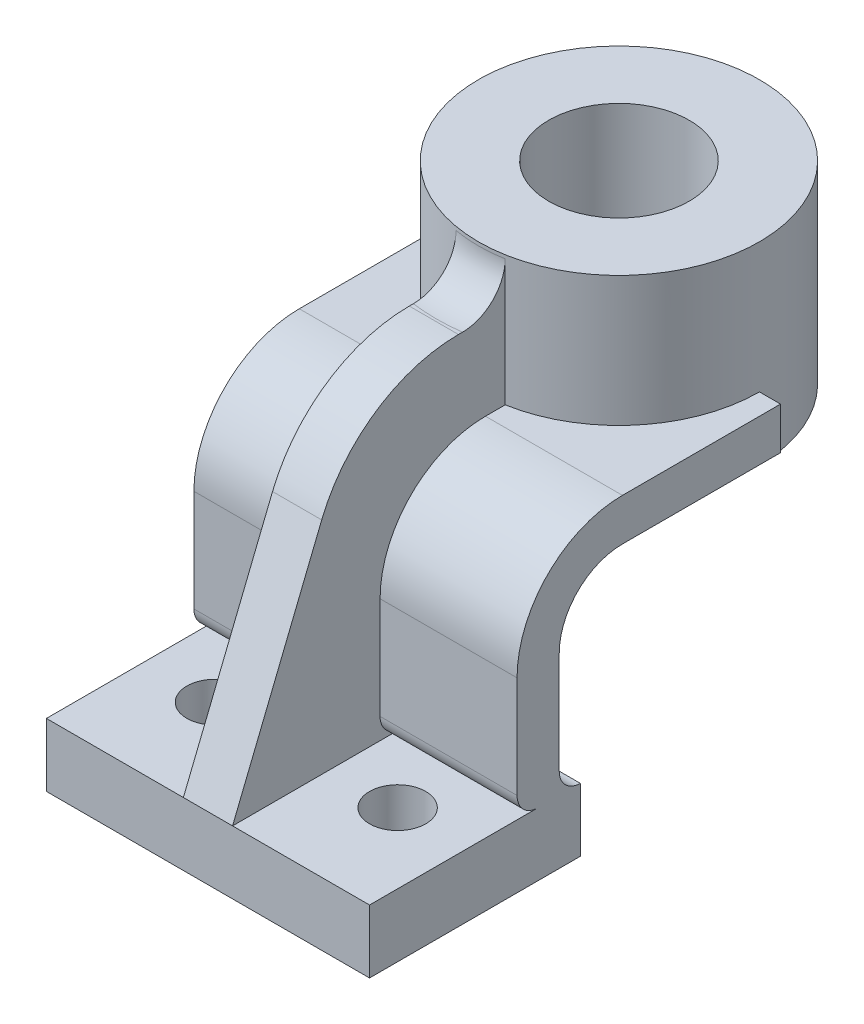
ISO-10303-21;
HEADER;
FILE_DESCRIPTION(('STEP AP214'),'2;1');
FILE_NAME('part.step','',(''),(''),'','','');
FILE_SCHEMA(('AUTOMOTIVE_DESIGN { 1 0 10303 214 1 1 1 1 }'));
ENDSEC;
DATA;
#1=APPLICATION_CONTEXT('core data for automotive mechanical design processes');
#2=APPLICATION_PROTOCOL_DEFINITION('international standard','automotive_design',2000,#1);
#3=PRODUCT_CONTEXT('',#1,'mechanical');
#4=PRODUCT('Part','Part','',(#3));
#5=PRODUCT_RELATED_PRODUCT_CATEGORY('part','',(#4));
#6=PRODUCT_DEFINITION_FORMATION('','',#4);
#7=PRODUCT_DEFINITION_CONTEXT('part definition',#1,'design');
#8=PRODUCT_DEFINITION('design','',#6,#7);
#9=PRODUCT_DEFINITION_SHAPE('','',#8);
#10=(LENGTH_UNIT() NAMED_UNIT(*) SI_UNIT(.MILLI.,.METRE.));
#11=(NAMED_UNIT(*) PLANE_ANGLE_UNIT() SI_UNIT($,.RADIAN.));
#12=(NAMED_UNIT(*) SI_UNIT($,.STERADIAN.) SOLID_ANGLE_UNIT());
#13=UNCERTAINTY_MEASURE_WITH_UNIT(LENGTH_MEASURE(1.E-05),#10,'distance_accuracy_value','');
#14=(GEOMETRIC_REPRESENTATION_CONTEXT(3) GLOBAL_UNCERTAINTY_ASSIGNED_CONTEXT((#13)) GLOBAL_UNIT_ASSIGNED_CONTEXT((#10,
#11,#12)) REPRESENTATION_CONTEXT('',''));
#15=CARTESIAN_POINT('',(0.,0.,0.));
#16=DIRECTION('',(0.,0.,1.));
#17=DIRECTION('',(1.,0.,0.));
#18=AXIS2_PLACEMENT_3D('',#15,#16,#17);
#19=CARTESIAN_POINT('',(0.,18.,0.));
#20=DIRECTION('',(0.,-1.,0.));
#21=DIRECTION('',(0.,0.,-1.));
#22=AXIS2_PLACEMENT_3D('',#19,#20,#21);
#23=PLANE('',#22);
#24=CARTESIAN_POINT('',(-26.,18.,1.99999999999999));
#25=DIRECTION('',(0.,1.,0.));
#26=DIRECTION('',(0.,0.,-1.));
#27=AXIS2_PLACEMENT_3D('',#24,#25,#26);
#28=CIRCLE('',#27,8.);
#29=CARTESIAN_POINT('',(-26.,18.,-6.00000000000001));
#30=VERTEX_POINT('',#29);
#31=EDGE_CURVE('E273',#30,#30,#28,.T.);
#32=ORIENTED_EDGE('',*,*,#31,.F.);
#33=EDGE_LOOP('',(#32));
#34=FACE_BOUND('',#33,.T.);
#35=DIRECTION('',(0.,0.,1.));
#36=VECTOR('',#35,1.);
#37=CARTESIAN_POINT('',(-7.,18.,0.));
#38=LINE('',#37,#36);
#39=CARTESIAN_POINT('',(-7.,18.,-18.));
#40=VERTEX_POINT('',#39);
#41=CARTESIAN_POINT('',(-7.,18.,30.));
#42=VERTEX_POINT('',#41);
#43=EDGE_CURVE('E230',#40,#42,#38,.T.);
#44=ORIENTED_EDGE('',*,*,#43,.F.);
#45=DIRECTION('',(1.,0.,0.));
#46=VECTOR('',#45,1.);
#47=CARTESIAN_POINT('',(-46.,18.,-18.));
#48=LINE('',#47,#46);
#49=CARTESIAN_POINT('',(-46.,18.,-18.));
#50=VERTEX_POINT('',#49);
#51=EDGE_CURVE('E297',#50,#40,#48,.T.);
#52=ORIENTED_EDGE('',*,*,#51,.F.);
#53=DIRECTION('',(0.,0.,1.));
#54=VECTOR('',#53,1.);
#55=CARTESIAN_POINT('',(-46.,18.,30.));
#56=LINE('',#55,#54);
#57=CARTESIAN_POINT('',(-46.,18.,30.));
#58=VERTEX_POINT('',#57);
#59=EDGE_CURVE('E251',#50,#58,#56,.T.);
#60=ORIENTED_EDGE('',*,*,#59,.T.);
#61=DIRECTION('',(1.,0.,0.));
#62=VECTOR('',#61,1.);
#63=CARTESIAN_POINT('',(-46.,18.,30.));
#64=LINE('',#63,#62);
#65=EDGE_CURVE('E245',#58,#42,#64,.T.);
#66=ORIENTED_EDGE('',*,*,#65,.T.);
#67=EDGE_LOOP('',(#44,#52,#60,#66));
#68=FACE_BOUND('',#67,.T.);
#69=ADVANCED_FACE('F41',(#34,#68),#23,.F.);
#70=CARTESIAN_POINT('',(-46.,0.,-12.));
#71=DIRECTION('',(0.,0.,-1.));
#72=DIRECTION('',(-1.,0.,0.));
#73=AXIS2_PLACEMENT_3D('',#70,#71,#72);
#74=PLANE('',#73);
#75=DIRECTION('',(0.,-1.,0.));
#76=VECTOR('',#75,1.);
#77=CARTESIAN_POINT('',(-7.,0.,-12.));
#78=LINE('',#77,#76);
#79=CARTESIAN_POINT('',(-7.,52.9999999999999,-12.));
#80=VERTEX_POINT('',#79);
#81=CARTESIAN_POINT('',(-7.,24.,-12.));
#82=VERTEX_POINT('',#81);
#83=EDGE_CURVE('E439',#80,#82,#78,.T.);
#84=ORIENTED_EDGE('',*,*,#83,.F.);
#85=DIRECTION('',(1.,0.,0.));
#86=VECTOR('',#85,1.);
#87=CARTESIAN_POINT('',(-46.,52.9999999999999,-12.));
#88=LINE('',#87,#86);
#89=CARTESIAN_POINT('',(-46.,52.9999999999999,-12.));
#90=VERTEX_POINT('',#89);
#91=EDGE_CURVE('E278',#90,#80,#88,.T.);
#92=ORIENTED_EDGE('',*,*,#91,.F.);
#93=DIRECTION('',(0.,1.,0.));
#94=VECTOR('',#93,1.);
#95=CARTESIAN_POINT('',(-46.,0.,-12.));
#96=LINE('',#95,#94);
#97=CARTESIAN_POINT('',(-46.,24.,-12.));
#98=VERTEX_POINT('',#97);
#99=EDGE_CURVE('E329',#98,#90,#96,.T.);
#100=ORIENTED_EDGE('',*,*,#99,.F.);
#101=DIRECTION('',(1.,0.,0.));
#102=VECTOR('',#101,1.);
#103=CARTESIAN_POINT('',(-46.,24.,-12.));
#104=LINE('',#103,#102);
#105=EDGE_CURVE('E291',#98,#82,#104,.T.);
#106=ORIENTED_EDGE('',*,*,#105,.T.);
#107=EDGE_LOOP('',(#84,#92,#100,#106));
#108=FACE_BOUND('',#107,.T.);
#109=ADVANCED_FACE('F545',(#108),#74,.F.);
#110=CARTESIAN_POINT('',(-46.,53.,-42.));
#111=DIRECTION('',(1.,0.,0.));
#112=DIRECTION('',(0.,0.,-1.));
#113=AXIS2_PLACEMENT_3D('',#110,#111,#112);
#114=CYLINDRICAL_SURFACE('',#113,30.);
#115=CARTESIAN_POINT('',(-7.,53.,-42.));
#116=DIRECTION('',(1.,0.,0.));
#117=DIRECTION('',(0.,0.,-1.));
#118=AXIS2_PLACEMENT_3D('',#115,#116,#117);
#119=CIRCLE('',#118,30.);
#120=CARTESIAN_POINT('',(-7.,83.,-42.0000000000002));
#121=VERTEX_POINT('',#120);
#122=EDGE_CURVE('E436',#121,#80,#119,.T.);
#123=ORIENTED_EDGE('',*,*,#122,.F.);
#124=DIRECTION('',(1.,0.,0.));
#125=VECTOR('',#124,1.);
#126=CARTESIAN_POINT('',(-46.,83.,-42.0000000000002));
#127=LINE('',#126,#125);
#128=CARTESIAN_POINT('',(-46.,83.,-42.0000000000002));
#129=VERTEX_POINT('',#128);
#130=EDGE_CURVE('E317',#129,#121,#127,.T.);
#131=ORIENTED_EDGE('',*,*,#130,.F.);
#132=CARTESIAN_POINT('',(-46.,53.,-42.));
#133=DIRECTION('',(1.,0.,0.));
#134=DIRECTION('',(0.,0.,-1.));
#135=AXIS2_PLACEMENT_3D('',#132,#133,#134);
#136=CIRCLE('',#135,30.);
#137=EDGE_CURVE('E359',#90,#129,#136,.F.);
#138=ORIENTED_EDGE('',*,*,#137,.F.);
#139=ORIENTED_EDGE('',*,*,#91,.T.);
#140=EDGE_LOOP('',(#123,#131,#138,#139));
#141=FACE_BOUND('',#140,.T.);
#142=ADVANCED_FACE('F514',(#141),#114,.T.);
#143=CARTESIAN_POINT('',(-46.,83.,0.));
#144=DIRECTION('',(0.,-1.,0.));
#145=DIRECTION('',(0.,0.,-1.));
#146=AXIS2_PLACEMENT_3D('',#143,#144,#145);
#147=PLANE('',#146);
#148=DIRECTION('',(0.,0.,1.));
#149=VECTOR('',#148,1.);
#150=CARTESIAN_POINT('',(-7.,83.,0.));
#151=LINE('',#150,#149);
#152=CARTESIAN_POINT('',(-7.,83.,-47.6172626649696));
#153=VERTEX_POINT('',#152);
#154=EDGE_CURVE('E433',#153,#121,#151,.T.);
#155=ORIENTED_EDGE('',*,*,#154,.F.);
#156=CARTESIAN_POINT('',(0.,83.,-87.));
#157=DIRECTION('',(0.,-1.,0.));
#158=DIRECTION('',(0.,0.,-1.));
#159=AXIS2_PLACEMENT_3D('',#156,#157,#158);
#160=CIRCLE('',#159,40.);
#161=CARTESIAN_POINT('',(-40.,83.,-87.));
#162=VERTEX_POINT('',#161);
#163=EDGE_CURVE('E389',#153,#162,#160,.T.);
#164=ORIENTED_EDGE('',*,*,#163,.T.);
#165=DIRECTION('',(1.,0.,0.));
#166=VECTOR('',#165,1.);
#167=CARTESIAN_POINT('',(-46.,83.,-87.));
#168=LINE('',#167,#166);
#169=CARTESIAN_POINT('',(-46.,83.,-87.));
#170=VERTEX_POINT('',#169);
#171=EDGE_CURVE('E312',#170,#162,#168,.T.);
#172=ORIENTED_EDGE('',*,*,#171,.F.);
#173=DIRECTION('',(0.,0.,-1.));
#174=VECTOR('',#173,1.);
#175=CARTESIAN_POINT('',(-46.,83.,0.));
#176=LINE('',#175,#174);
#177=EDGE_CURVE('E362',#129,#170,#176,.T.);
#178=ORIENTED_EDGE('',*,*,#177,.F.);
#179=ORIENTED_EDGE('',*,*,#130,.T.);
#180=EDGE_LOOP('',(#155,#164,#172,#178,#179));
#181=FACE_BOUND('',#180,.T.);
#182=ADVANCED_FACE('F519',(#181),#147,.F.);
#183=CARTESIAN_POINT('',(-46.,24.,-18.));
#184=DIRECTION('',(1.,0.,0.));
#185=DIRECTION('',(0.,0.,-1.));
#186=AXIS2_PLACEMENT_3D('',#183,#184,#185);
#187=CYLINDRICAL_SURFACE('',#186,6.);
#188=ORIENTED_EDGE('',*,*,#51,.T.);
#189=CARTESIAN_POINT('',(-7.,24.,-18.));
#190=DIRECTION('',(1.,0.,0.));
#191=DIRECTION('',(0.,0.,-1.));
#192=AXIS2_PLACEMENT_3D('',#189,#190,#191);
#193=CIRCLE('',#192,6.);
#194=EDGE_CURVE('E233',#40,#82,#193,.F.);
#195=ORIENTED_EDGE('',*,*,#194,.T.);
#196=ORIENTED_EDGE('',*,*,#105,.F.);
#197=CARTESIAN_POINT('',(-46.,24.,-18.));
#198=DIRECTION('',(1.,0.,0.));
#199=DIRECTION('',(0.,0.,-1.));
#200=AXIS2_PLACEMENT_3D('',#197,#198,#199);
#201=CIRCLE('',#200,6.);
#202=EDGE_CURVE('E379',#98,#50,#201,.T.);
#203=ORIENTED_EDGE('',*,*,#202,.T.);
#204=EDGE_LOOP('',(#188,#195,#196,#203));
#205=FACE_BOUND('',#204,.T.);
#206=ADVANCED_FACE('F540',(#205),#187,.T.);
#207=CARTESIAN_POINT('',(-46.,0.,-87.));
#208=DIRECTION('',(0.,0.,1.));
#209=DIRECTION('',(1.,0.,0.));
#210=AXIS2_PLACEMENT_3D('',#207,#208,#209);
#211=PLANE('',#210);
#212=DIRECTION('',(1.,0.,0.));
#213=VECTOR('',#212,1.);
#214=CARTESIAN_POINT('',(-46.,71.,-87.));
#215=LINE('',#214,#213);
#216=CARTESIAN_POINT('',(40.,71.,-87.));
#217=VERTEX_POINT('',#216);
#218=CARTESIAN_POINT('',(46.,71.,-87.));
#219=VERTEX_POINT('',#218);
#220=EDGE_CURVE('E306',#217,#219,#215,.T.);
#221=ORIENTED_EDGE('',*,*,#220,.F.);
#222=DIRECTION('',(0.,1.,0.));
#223=VECTOR('',#222,1.);
#224=CARTESIAN_POINT('',(40.,65.,-87.));
#225=LINE('',#224,#223);
#226=CARTESIAN_POINT('',(40.,83.,-87.));
#227=VERTEX_POINT('',#226);
#228=EDGE_CURVE('E390',#217,#227,#225,.T.);
#229=ORIENTED_EDGE('',*,*,#228,.T.);
#230=CARTESIAN_POINT('',(46.,83.,-87.));
#231=VERTEX_POINT('',#230);
#232=EDGE_CURVE('E311',#227,#231,#168,.T.);
#233=ORIENTED_EDGE('',*,*,#232,.T.);
#234=DIRECTION('',(0.,-1.,0.));
#235=VECTOR('',#234,1.);
#236=CARTESIAN_POINT('',(46.,0.,-87.));
#237=LINE('',#236,#235);
#238=EDGE_CURVE('E334',#231,#219,#237,.T.);
#239=ORIENTED_EDGE('',*,*,#238,.T.);
#240=EDGE_LOOP('',(#221,#229,#233,#239));
#241=FACE_BOUND('',#240,.T.);
#242=ADVANCED_FACE('F524',(#241),#211,.F.);
#243=CARTESIAN_POINT('',(26.,18.,1.99999999999999));
#244=DIRECTION('',(0.,1.,0.));
#245=DIRECTION('',(0.,0.,1.));
#246=AXIS2_PLACEMENT_3D('',#243,#244,#245);
#247=CIRCLE('',#246,8.);
#248=CARTESIAN_POINT('',(26.,18.,10.));
#249=VERTEX_POINT('',#248);
#250=EDGE_CURVE('E282',#249,#249,#247,.T.);
#251=ORIENTED_EDGE('',*,*,#250,.F.);
#252=EDGE_LOOP('',(#251));
#253=FACE_BOUND('',#252,.T.);
#254=CARTESIAN_POINT('',(7.,18.,-18.));
#255=VERTEX_POINT('',#254);
#256=CARTESIAN_POINT('',(46.,18.,-18.));
#257=VERTEX_POINT('',#256);
#258=EDGE_CURVE('E295',#255,#257,#48,.T.);
#259=ORIENTED_EDGE('',*,*,#258,.F.);
#260=DIRECTION('',(0.,0.,1.));
#261=VECTOR('',#260,1.);
#262=CARTESIAN_POINT('',(7.,18.,0.));
#263=LINE('',#262,#261);
#264=CARTESIAN_POINT('',(7.,18.,30.));
#265=VERTEX_POINT('',#264);
#266=EDGE_CURVE('E428',#255,#265,#263,.T.);
#267=ORIENTED_EDGE('',*,*,#266,.T.);
#268=CARTESIAN_POINT('',(46.,18.,30.));
#269=VERTEX_POINT('',#268);
#270=EDGE_CURVE('E247',#265,#269,#64,.T.);
#271=ORIENTED_EDGE('',*,*,#270,.T.);
#272=DIRECTION('',(0.,0.,-1.));
#273=VECTOR('',#272,1.);
#274=CARTESIAN_POINT('',(46.,18.,30.));
#275=LINE('',#274,#273);
#276=EDGE_CURVE('E267',#269,#257,#275,.T.);
#277=ORIENTED_EDGE('',*,*,#276,.T.);
#278=EDGE_LOOP('',(#259,#267,#271,#277));
#279=FACE_BOUND('',#278,.T.);
#280=ADVANCED_FACE('F562',(#253,#279),#23,.F.);
#281=CARTESIAN_POINT('',(46.,18.,30.));
#282=DIRECTION('',(-1.,0.,0.));
#283=DIRECTION('',(0.,0.,1.));
#284=AXIS2_PLACEMENT_3D('',#281,#282,#283);
#285=PLANE('',#284);
#286=DIRECTION('',(0.,0.,-1.));
#287=VECTOR('',#286,1.);
#288=CARTESIAN_POINT('',(46.,0.,30.));
#289=LINE('',#288,#287);
#290=CARTESIAN_POINT('',(46.,0.,30.));
#291=VERTEX_POINT('',#290);
#292=CARTESIAN_POINT('',(46.,0.,-30.));
#293=VERTEX_POINT('',#292);
#294=EDGE_CURVE('E290',#291,#293,#289,.T.);
#295=ORIENTED_EDGE('',*,*,#294,.T.);
#296=DIRECTION('',(0.,-1.,0.));
#297=VECTOR('',#296,1.);
#298=CARTESIAN_POINT('',(46.,18.,-30.));
#299=LINE('',#298,#297);
#300=CARTESIAN_POINT('',(46.,18.,-30.));
#301=VERTEX_POINT('',#300);
#302=EDGE_CURVE('E648',#301,#293,#299,.T.);
#303=ORIENTED_EDGE('',*,*,#302,.F.);
#304=CARTESIAN_POINT('',(46.,24.,-30.));
#305=DIRECTION('',(-1.,0.,0.));
#306=DIRECTION('',(0.,0.,1.));
#307=AXIS2_PLACEMENT_3D('',#304,#305,#306);
#308=CIRCLE('',#307,6.);
#309=CARTESIAN_POINT('',(46.,24.,-24.));
#310=VERTEX_POINT('',#309);
#311=EDGE_CURVE('E655',#301,#310,#308,.T.);
#312=ORIENTED_EDGE('',*,*,#311,.T.);
#313=DIRECTION('',(0.,1.,0.));
#314=VECTOR('',#313,1.);
#315=CARTESIAN_POINT('',(46.,0.,-24.));
#316=LINE('',#315,#314);
#317=CARTESIAN_POINT('',(46.,52.9999999999999,-24.));
#318=VERTEX_POINT('',#317);
#319=EDGE_CURVE('E346',#310,#318,#316,.T.);
#320=ORIENTED_EDGE('',*,*,#319,.T.);
#321=CARTESIAN_POINT('',(46.,53.,-42.));
#322=DIRECTION('',(1.,0.,0.));
#323=DIRECTION('',(0.,0.,-1.));
#324=AXIS2_PLACEMENT_3D('',#321,#322,#323);
#325=CIRCLE('',#324,18.);
#326=CARTESIAN_POINT('',(46.,71.,-42.0000000000001));
#327=VERTEX_POINT('',#326);
#328=EDGE_CURVE('E342',#318,#327,#325,.F.);
#329=ORIENTED_EDGE('',*,*,#328,.T.);
#330=DIRECTION('',(0.,0.,-1.));
#331=VECTOR('',#330,1.);
#332=CARTESIAN_POINT('',(46.,71.,0.));
#333=LINE('',#332,#331);
#334=EDGE_CURVE('E338',#327,#219,#333,.T.);
#335=ORIENTED_EDGE('',*,*,#334,.T.);
#336=ORIENTED_EDGE('',*,*,#238,.F.);
#337=DIRECTION('',(0.,0.,-1.));
#338=VECTOR('',#337,1.);
#339=CARTESIAN_POINT('',(46.,83.,0.));
#340=LINE('',#339,#338);
#341=CARTESIAN_POINT('',(46.,83.,-42.0000000000002));
#342=VERTEX_POINT('',#341);
#343=EDGE_CURVE('E330',#342,#231,#340,.T.);
#344=ORIENTED_EDGE('',*,*,#343,.F.);
#345=CARTESIAN_POINT('',(46.,53.,-42.));
#346=DIRECTION('',(1.,0.,0.));
#347=DIRECTION('',(0.,0.,-1.));
#348=AXIS2_PLACEMENT_3D('',#345,#346,#347);
#349=CIRCLE('',#348,30.);
#350=CARTESIAN_POINT('',(46.,52.9999999999999,-12.));
#351=VERTEX_POINT('',#350);
#352=EDGE_CURVE('E325',#351,#342,#349,.F.);
#353=ORIENTED_EDGE('',*,*,#352,.F.);
#354=DIRECTION('',(0.,1.,0.));
#355=VECTOR('',#354,1.);
#356=CARTESIAN_POINT('',(46.,0.,-12.));
#357=LINE('',#356,#355);
#358=CARTESIAN_POINT('',(46.,24.,-12.));
#359=VERTEX_POINT('',#358);
#360=EDGE_CURVE('E354',#359,#351,#357,.T.);
#361=ORIENTED_EDGE('',*,*,#360,.F.);
#362=CARTESIAN_POINT('',(46.,24.,-18.));
#363=DIRECTION('',(1.,0.,0.));
#364=DIRECTION('',(0.,0.,-1.));
#365=AXIS2_PLACEMENT_3D('',#362,#363,#364);
#366=CIRCLE('',#365,6.);
#367=EDGE_CURVE('E350',#359,#257,#366,.T.);
#368=ORIENTED_EDGE('',*,*,#367,.T.);
#369=ORIENTED_EDGE('',*,*,#276,.F.);
#370=DIRECTION('',(0.,-1.,0.));
#371=VECTOR('',#370,1.);
#372=CARTESIAN_POINT('',(46.,18.,30.));
#373=LINE('',#372,#371);
#374=EDGE_CURVE('E254',#269,#291,#373,.T.);
#375=ORIENTED_EDGE('',*,*,#374,.T.);
#376=EDGE_LOOP('',(#295,#303,#312,#320,#329,#335,#336,#344,#353,#361,#368,#369,#375));
#377=FACE_BOUND('',#376,.T.);
#378=ADVANCED_FACE('F565',(#377),#285,.F.);
#379=CARTESIAN_POINT('',(-46.,18.,-30.));
#380=DIRECTION('',(0.,0.,1.));
#381=DIRECTION('',(1.,0.,0.));
#382=AXIS2_PLACEMENT_3D('',#379,#380,#381);
#383=PLANE('',#382);
#384=DIRECTION('',(-1.,0.,0.));
#385=VECTOR('',#384,1.);
#386=CARTESIAN_POINT('',(-46.,0.,-30.));
#387=LINE('',#386,#385);
#388=CARTESIAN_POINT('',(-46.,0.,-30.));
#389=VERTEX_POINT('',#388);
#390=EDGE_CURVE('E633',#293,#389,#387,.T.);
#391=ORIENTED_EDGE('',*,*,#390,.T.);
#392=DIRECTION('',(0.,-1.,0.));
#393=VECTOR('',#392,1.);
#394=CARTESIAN_POINT('',(-46.,18.,-30.));
#395=LINE('',#394,#393);
#396=CARTESIAN_POINT('',(-46.,18.,-30.));
#397=VERTEX_POINT('',#396);
#398=EDGE_CURVE('E644',#397,#389,#395,.T.);
#399=ORIENTED_EDGE('',*,*,#398,.F.);
#400=DIRECTION('',(-1.,0.,0.));
#401=VECTOR('',#400,1.);
#402=CARTESIAN_POINT('',(-46.,18.,-30.));
#403=LINE('',#402,#401);
#404=EDGE_CURVE('E265',#301,#397,#403,.T.);
#405=ORIENTED_EDGE('',*,*,#404,.F.);
#406=ORIENTED_EDGE('',*,*,#302,.T.);
#407=EDGE_LOOP('',(#391,#399,#405,#406));
#408=FACE_BOUND('',#407,.T.);
#409=ADVANCED_FACE('F575',(#408),#383,.F.);
#410=CARTESIAN_POINT('',(-46.,18.,30.));
#411=DIRECTION('',(1.,0.,0.));
#412=DIRECTION('',(0.,0.,-1.));
#413=AXIS2_PLACEMENT_3D('',#410,#411,#412);
#414=PLANE('',#413);
#415=DIRECTION('',(0.,0.,1.));
#416=VECTOR('',#415,1.);
#417=CARTESIAN_POINT('',(-46.,0.,30.));
#418=LINE('',#417,#416);
#419=CARTESIAN_POINT('',(-46.,0.,30.));
#420=VERTEX_POINT('',#419);
#421=EDGE_CURVE('E635',#389,#420,#418,.T.);
#422=ORIENTED_EDGE('',*,*,#421,.T.);
#423=DIRECTION('',(0.,-1.,0.));
#424=VECTOR('',#423,1.);
#425=CARTESIAN_POINT('',(-46.,18.,30.));
#426=LINE('',#425,#424);
#427=EDGE_CURVE('E257',#58,#420,#426,.T.);
#428=ORIENTED_EDGE('',*,*,#427,.F.);
#429=ORIENTED_EDGE('',*,*,#59,.F.);
#430=ORIENTED_EDGE('',*,*,#202,.F.);
#431=ORIENTED_EDGE('',*,*,#99,.T.);
#432=ORIENTED_EDGE('',*,*,#137,.T.);
#433=ORIENTED_EDGE('',*,*,#177,.T.);
#434=DIRECTION('',(0.,-1.,0.));
#435=VECTOR('',#434,1.);
#436=CARTESIAN_POINT('',(-46.,0.,-87.));
#437=LINE('',#436,#435);
#438=CARTESIAN_POINT('',(-46.,71.,-87.));
#439=VERTEX_POINT('',#438);
#440=EDGE_CURVE('E365',#170,#439,#437,.T.);
#441=ORIENTED_EDGE('',*,*,#440,.T.);
#442=DIRECTION('',(0.,0.,-1.));
#443=VECTOR('',#442,1.);
#444=CARTESIAN_POINT('',(-46.,71.,0.));
#445=LINE('',#444,#443);
#446=CARTESIAN_POINT('',(-46.,71.,-42.0000000000001));
#447=VERTEX_POINT('',#446);
#448=EDGE_CURVE('E368',#447,#439,#445,.T.);
#449=ORIENTED_EDGE('',*,*,#448,.F.);
#450=CARTESIAN_POINT('',(-46.,53.,-42.));
#451=DIRECTION('',(1.,0.,0.));
#452=DIRECTION('',(0.,0.,-1.));
#453=AXIS2_PLACEMENT_3D('',#450,#451,#452);
#454=CIRCLE('',#453,18.);
#455=CARTESIAN_POINT('',(-46.,52.9999999999999,-24.));
#456=VERTEX_POINT('',#455);
#457=EDGE_CURVE('E372',#456,#447,#454,.F.);
#458=ORIENTED_EDGE('',*,*,#457,.F.);
#459=DIRECTION('',(0.,1.,0.));
#460=VECTOR('',#459,1.);
#461=CARTESIAN_POINT('',(-46.,0.,-24.));
#462=LINE('',#461,#460);
#463=CARTESIAN_POINT('',(-46.,24.,-24.));
#464=VERTEX_POINT('',#463);
#465=EDGE_CURVE('E376',#464,#456,#462,.T.);
#466=ORIENTED_EDGE('',*,*,#465,.F.);
#467=CARTESIAN_POINT('',(-46.,24.,-30.));
#468=DIRECTION('',(1.,0.,0.));
#469=DIRECTION('',(0.,0.,-1.));
#470=AXIS2_PLACEMENT_3D('',#467,#468,#469);
#471=CIRCLE('',#470,6.);
#472=EDGE_CURVE('E658',#464,#397,#471,.T.);
#473=ORIENTED_EDGE('',*,*,#472,.T.);
#474=ORIENTED_EDGE('',*,*,#398,.T.);
#475=EDGE_LOOP('',(#422,#428,#429,#430,#431,#432,#433,#441,#449,#458,#466,#473,#474));
#476=FACE_BOUND('',#475,.T.);
#477=ADVANCED_FACE('F572',(#476),#414,.F.);
#478=CARTESIAN_POINT('',(-46.,18.,30.));
#479=DIRECTION('',(0.,0.,-1.));
#480=DIRECTION('',(-1.,0.,0.));
#481=AXIS2_PLACEMENT_3D('',#478,#479,#480);
#482=PLANE('',#481);
#483=ORIENTED_EDGE('',*,*,#270,.F.);
#484=EDGE_CURVE('E219',#42,#265,#64,.T.);
#485=ORIENTED_EDGE('',*,*,#484,.F.);
#486=ORIENTED_EDGE('',*,*,#65,.F.);
#487=ORIENTED_EDGE('',*,*,#427,.T.);
#488=DIRECTION('',(1.,0.,0.));
#489=VECTOR('',#488,1.);
#490=CARTESIAN_POINT('',(-46.,0.,30.));
#491=LINE('',#490,#489);
#492=EDGE_CURVE('E272',#420,#291,#491,.T.);
#493=ORIENTED_EDGE('',*,*,#492,.T.);
#494=ORIENTED_EDGE('',*,*,#374,.F.);
#495=EDGE_LOOP('',(#483,#485,#486,#487,#493,#494));
#496=FACE_BOUND('',#495,.T.);
#497=ADVANCED_FACE('F243',(#496),#482,.F.);
#498=CARTESIAN_POINT('',(0.,0.,0.));
#499=DIRECTION('',(0.,-1.,0.));
#500=DIRECTION('',(0.,0.,-1.));
#501=AXIS2_PLACEMENT_3D('',#498,#499,#500);
#502=PLANE('',#501);
#503=ORIENTED_EDGE('',*,*,#294,.F.);
#504=ORIENTED_EDGE('',*,*,#492,.F.);
#505=ORIENTED_EDGE('',*,*,#421,.F.);
#506=ORIENTED_EDGE('',*,*,#390,.F.);
#507=EDGE_LOOP('',(#503,#504,#505,#506));
#508=FACE_BOUND('',#507,.T.);
#509=ADVANCED_FACE('F560',(#508),#502,.T.);
#510=CARTESIAN_POINT('',(-26.,3.,1.99999999999999));
#511=DIRECTION('',(0.,1.,0.));
#512=DIRECTION('',(0.,0.,1.));
#513=AXIS2_PLACEMENT_3D('',#510,#511,#512);
#514=CYLINDRICAL_SURFACE('',#513,8.);
#515=CARTESIAN_POINT('',(-26.,3.,1.99999999999999));
#516=DIRECTION('',(0.,1.,0.));
#517=DIRECTION('',(0.,0.,-1.));
#518=AXIS2_PLACEMENT_3D('',#515,#516,#517);
#519=CIRCLE('',#518,8.);
#520=CARTESIAN_POINT('',(-26.,3.,-6.00000000000001));
#521=VERTEX_POINT('',#520);
#522=EDGE_CURVE('E277',#521,#521,#519,.T.);
#523=ORIENTED_EDGE('',*,*,#522,.F.);
#524=EDGE_LOOP('',(#523));
#525=FACE_BOUND('',#524,.T.);
#526=ORIENTED_EDGE('',*,*,#31,.T.);
#527=EDGE_LOOP('',(#526));
#528=FACE_BOUND('',#527,.T.);
#529=ADVANCED_FACE('F556',(#525,#528),#514,.F.);
#530=CARTESIAN_POINT('',(-26.,3.,1.99999999999999));
#531=DIRECTION('',(0.,-1.,0.));
#532=DIRECTION('',(0.,0.,-1.));
#533=AXIS2_PLACEMENT_3D('',#530,#531,#532);
#534=PLANE('',#533);
#535=ORIENTED_EDGE('',*,*,#522,.T.);
#536=EDGE_LOOP('',(#535));
#537=FACE_BOUND('',#536,.T.);
#538=ADVANCED_FACE('F552',(#537),#534,.F.);
#539=CARTESIAN_POINT('',(26.,3.,1.99999999999999));
#540=DIRECTION('',(0.,1.,0.));
#541=DIRECTION('',(0.,0.,1.));
#542=AXIS2_PLACEMENT_3D('',#539,#540,#541);
#543=CYLINDRICAL_SURFACE('',#542,8.);
#544=CARTESIAN_POINT('',(26.,3.,1.99999999999999));
#545=DIRECTION('',(0.,1.,0.));
#546=DIRECTION('',(0.,0.,1.));
#547=AXIS2_PLACEMENT_3D('',#544,#545,#546);
#548=CIRCLE('',#547,8.);
#549=CARTESIAN_POINT('',(26.,3.,10.));
#550=VERTEX_POINT('',#549);
#551=EDGE_CURVE('E286',#550,#550,#548,.T.);
#552=ORIENTED_EDGE('',*,*,#551,.F.);
#553=EDGE_LOOP('',(#552));
#554=FACE_BOUND('',#553,.T.);
#555=ORIENTED_EDGE('',*,*,#250,.T.);
#556=EDGE_LOOP('',(#555));
#557=FACE_BOUND('',#556,.T.);
#558=ADVANCED_FACE('F548',(#554,#557),#543,.F.);
#559=CARTESIAN_POINT('',(26.,3.,1.99999999999999));
#560=DIRECTION('',(0.,1.,0.));
#561=DIRECTION('',(0.,0.,1.));
#562=AXIS2_PLACEMENT_3D('',#559,#560,#561);
#563=PLANE('',#562);
#564=ORIENTED_EDGE('',*,*,#551,.T.);
#565=EDGE_LOOP('',(#564));
#566=FACE_BOUND('',#565,.T.);
#567=ADVANCED_FACE('F543',(#566),#563,.T.);
#568=CARTESIAN_POINT('',(7.,52.9999999999999,-12.));
#569=VERTEX_POINT('',#568);
#570=EDGE_CURVE('E321',#569,#351,#88,.T.);
#571=ORIENTED_EDGE('',*,*,#570,.F.);
#572=DIRECTION('',(0.,-1.,0.));
#573=VECTOR('',#572,1.);
#574=CARTESIAN_POINT('',(7.,0.,-12.));
#575=LINE('',#574,#573);
#576=CARTESIAN_POINT('',(7.,24.,-12.));
#577=VERTEX_POINT('',#576);
#578=EDGE_CURVE('E421',#569,#577,#575,.T.);
#579=ORIENTED_EDGE('',*,*,#578,.T.);
#580=EDGE_CURVE('E296',#577,#359,#104,.T.);
#581=ORIENTED_EDGE('',*,*,#580,.T.);
#582=ORIENTED_EDGE('',*,*,#360,.T.);
#583=EDGE_LOOP('',(#571,#579,#581,#582));
#584=FACE_BOUND('',#583,.T.);
#585=ADVANCED_FACE('F512',(#584),#74,.F.);
#586=CARTESIAN_POINT('',(7.,83.,-42.0000000000002));
#587=VERTEX_POINT('',#586);
#588=EDGE_CURVE('E316',#587,#342,#127,.T.);
#589=ORIENTED_EDGE('',*,*,#588,.F.);
#590=CARTESIAN_POINT('',(7.,53.,-42.));
#591=DIRECTION('',(1.,0.,0.));
#592=DIRECTION('',(0.,0.,-1.));
#593=AXIS2_PLACEMENT_3D('',#590,#591,#592);
#594=CIRCLE('',#593,30.);
#595=EDGE_CURVE('E417',#587,#569,#594,.T.);
#596=ORIENTED_EDGE('',*,*,#595,.T.);
#597=ORIENTED_EDGE('',*,*,#570,.T.);
#598=ORIENTED_EDGE('',*,*,#352,.T.);
#599=EDGE_LOOP('',(#589,#596,#597,#598));
#600=FACE_BOUND('',#599,.T.);
#601=ADVANCED_FACE('F508',(#600),#114,.T.);
#602=CARTESIAN_POINT('',(7.,83.,-47.6172626649695));
#603=VERTEX_POINT('',#602);
#604=EDGE_CURVE('E358',#227,#603,#160,.T.);
#605=ORIENTED_EDGE('',*,*,#604,.T.);
#606=DIRECTION('',(0.,0.,1.));
#607=VECTOR('',#606,1.);
#608=CARTESIAN_POINT('',(7.,83.,0.));
#609=LINE('',#608,#607);
#610=EDGE_CURVE('E413',#603,#587,#609,.T.);
#611=ORIENTED_EDGE('',*,*,#610,.T.);
#612=ORIENTED_EDGE('',*,*,#588,.T.);
#613=ORIENTED_EDGE('',*,*,#343,.T.);
#614=ORIENTED_EDGE('',*,*,#232,.F.);
#615=EDGE_LOOP('',(#605,#611,#612,#613,#614));
#616=FACE_BOUND('',#615,.T.);
#617=ADVANCED_FACE('F511',(#616),#147,.F.);
#618=ORIENTED_EDGE('',*,*,#171,.T.);
#619=DIRECTION('',(0.,1.,0.));
#620=VECTOR('',#619,1.);
#621=CARTESIAN_POINT('',(-40.,65.,-87.));
#622=LINE('',#621,#620);
#623=CARTESIAN_POINT('',(-40.,71.,-87.));
#624=VERTEX_POINT('',#623);
#625=EDGE_CURVE('E393',#162,#624,#622,.F.);
#626=ORIENTED_EDGE('',*,*,#625,.T.);
#627=EDGE_CURVE('E307',#439,#624,#215,.T.);
#628=ORIENTED_EDGE('',*,*,#627,.F.);
#629=ORIENTED_EDGE('',*,*,#440,.F.);
#630=EDGE_LOOP('',(#618,#626,#628,#629));
#631=FACE_BOUND('',#630,.T.);
#632=ADVANCED_FACE('F517',(#631),#211,.F.);
#633=CARTESIAN_POINT('',(-46.,71.,0.));
#634=DIRECTION('',(0.,-1.,0.));
#635=DIRECTION('',(0.,0.,-1.));
#636=AXIS2_PLACEMENT_3D('',#633,#634,#635);
#637=PLANE('',#636);
#638=ORIENTED_EDGE('',*,*,#334,.F.);
#639=DIRECTION('',(1.,0.,0.));
#640=VECTOR('',#639,1.);
#641=CARTESIAN_POINT('',(-46.,71.,-42.0000000000001));
#642=LINE('',#641,#640);
#643=EDGE_CURVE('E303',#447,#327,#642,.T.);
#644=ORIENTED_EDGE('',*,*,#643,.F.);
#645=ORIENTED_EDGE('',*,*,#448,.T.);
#646=ORIENTED_EDGE('',*,*,#627,.T.);
#647=CARTESIAN_POINT('',(0.,71.,-87.));
#648=DIRECTION('',(0.,-1.,0.));
#649=DIRECTION('',(0.,0.,-1.));
#650=AXIS2_PLACEMENT_3D('',#647,#648,#649);
#651=CIRCLE('',#650,40.);
#652=EDGE_CURVE('E662',#217,#624,#651,.T.);
#653=ORIENTED_EDGE('',*,*,#652,.F.);
#654=ORIENTED_EDGE('',*,*,#220,.T.);
#655=EDGE_LOOP('',(#638,#644,#645,#646,#653,#654));
#656=FACE_BOUND('',#655,.T.);
#657=ADVANCED_FACE('F522',(#656),#637,.T.);
#658=CARTESIAN_POINT('',(-46.,53.,-42.));
#659=DIRECTION('',(1.,0.,0.));
#660=DIRECTION('',(0.,0.,-1.));
#661=AXIS2_PLACEMENT_3D('',#658,#659,#660);
#662=CYLINDRICAL_SURFACE('',#661,18.);
#663=ORIENTED_EDGE('',*,*,#328,.F.);
#664=DIRECTION('',(1.,0.,0.));
#665=VECTOR('',#664,1.);
#666=CARTESIAN_POINT('',(-46.,52.9999999999999,-24.));
#667=LINE('',#666,#665);
#668=EDGE_CURVE('E300',#456,#318,#667,.T.);
#669=ORIENTED_EDGE('',*,*,#668,.F.);
#670=ORIENTED_EDGE('',*,*,#457,.T.);
#671=ORIENTED_EDGE('',*,*,#643,.T.);
#672=EDGE_LOOP('',(#663,#669,#670,#671));
#673=FACE_BOUND('',#672,.T.);
#674=ADVANCED_FACE('F527',(#673),#662,.F.);
#675=CARTESIAN_POINT('',(-46.,0.,-24.));
#676=DIRECTION('',(0.,0.,-1.));
#677=DIRECTION('',(-1.,0.,0.));
#678=AXIS2_PLACEMENT_3D('',#675,#676,#677);
#679=PLANE('',#678);
#680=DIRECTION('',(1.,0.,0.));
#681=VECTOR('',#680,1.);
#682=CARTESIAN_POINT('',(-46.,24.,-24.));
#683=LINE('',#682,#681);
#684=EDGE_CURVE('E652',#310,#464,#683,.F.);
#685=ORIENTED_EDGE('',*,*,#684,.T.);
#686=ORIENTED_EDGE('',*,*,#465,.T.);
#687=ORIENTED_EDGE('',*,*,#668,.T.);
#688=ORIENTED_EDGE('',*,*,#319,.F.);
#689=EDGE_LOOP('',(#685,#686,#687,#688));
#690=FACE_BOUND('',#689,.T.);
#691=ADVANCED_FACE('F531',(#690),#679,.T.);
#692=CARTESIAN_POINT('',(7.,24.,-18.));
#693=DIRECTION('',(1.,0.,0.));
#694=DIRECTION('',(0.,0.,-1.));
#695=AXIS2_PLACEMENT_3D('',#692,#693,#694);
#696=CIRCLE('',#695,6.);
#697=EDGE_CURVE('E425',#255,#577,#696,.F.);
#698=ORIENTED_EDGE('',*,*,#697,.F.);
#699=ORIENTED_EDGE('',*,*,#258,.T.);
#700=ORIENTED_EDGE('',*,*,#367,.F.);
#701=ORIENTED_EDGE('',*,*,#580,.F.);
#702=EDGE_LOOP('',(#698,#699,#700,#701));
#703=FACE_BOUND('',#702,.T.);
#704=ADVANCED_FACE('F535',(#703),#187,.T.);
#705=CARTESIAN_POINT('',(0.,24.,-30.));
#706=DIRECTION('',(1.,0.,0.));
#707=DIRECTION('',(0.,0.,-1.));
#708=AXIS2_PLACEMENT_3D('',#705,#706,#707);
#709=CYLINDRICAL_SURFACE('',#708,6.);
#710=ORIENTED_EDGE('',*,*,#404,.T.);
#711=ORIENTED_EDGE('',*,*,#472,.F.);
#712=ORIENTED_EDGE('',*,*,#684,.F.);
#713=ORIENTED_EDGE('',*,*,#311,.F.);
#714=EDGE_LOOP('',(#710,#711,#712,#713));
#715=FACE_BOUND('',#714,.T.);
#716=ADVANCED_FACE('F507',(#715),#709,.F.);
#717=CARTESIAN_POINT('',(0.,65.,-87.));
#718=DIRECTION('',(0.,1.,0.));
#719=DIRECTION('',(0.,0.,1.));
#720=AXIS2_PLACEMENT_3D('',#717,#718,#719);
#721=CYLINDRICAL_SURFACE('',#720,40.);
#722=DIRECTION('',(0.,1.,0.));
#723=VECTOR('',#722,1.);
#724=CARTESIAN_POINT('',(-7.,65.,-47.6172626649696));
#725=LINE('',#724,#723);
#726=CARTESIAN_POINT('',(-7.,119.,-47.6172626649696));
#727=VERTEX_POINT('',#726);
#728=EDGE_CURVE('E63',#153,#727,#725,.T.);
#729=ORIENTED_EDGE('',*,*,#728,.T.);
#730=CARTESIAN_POINT('',(0.,119.,-87.));
#731=DIRECTION('',(0.,1.,0.));
#732=DIRECTION('',(0.,0.,1.));
#733=AXIS2_PLACEMENT_3D('',#730,#731,#732);
#734=CIRCLE('',#733,40.);
#735=CARTESIAN_POINT('',(7.,119.,-47.6172626649695));
#736=VERTEX_POINT('',#735);
#737=EDGE_CURVE('E474',#727,#736,#734,.T.);
#738=ORIENTED_EDGE('',*,*,#737,.T.);
#739=DIRECTION('',(0.,1.,0.));
#740=VECTOR('',#739,1.);
#741=CARTESIAN_POINT('',(7.,65.,-47.6172626649695));
#742=LINE('',#741,#740);
#743=EDGE_CURVE('E70',#603,#736,#742,.T.);
#744=ORIENTED_EDGE('',*,*,#743,.F.);
#745=ORIENTED_EDGE('',*,*,#604,.F.);
#746=ORIENTED_EDGE('',*,*,#228,.F.);
#747=ORIENTED_EDGE('',*,*,#652,.T.);
#748=ORIENTED_EDGE('',*,*,#625,.F.);
#749=ORIENTED_EDGE('',*,*,#163,.F.);
#750=EDGE_LOOP('',(#729,#738,#744,#745,#746,#747,#748,#749));
#751=FACE_BOUND('',#750,.T.);
#752=CARTESIAN_POINT('',(0.,65.,-87.));
#753=DIRECTION('',(0.,1.,0.));
#754=DIRECTION('',(0.,0.,1.));
#755=AXIS2_PLACEMENT_3D('',#752,#753,#754);
#756=CIRCLE('',#755,40.);
#757=CARTESIAN_POINT('',(0.,65.,-47.));
#758=VERTEX_POINT('',#757);
#759=EDGE_CURVE('E397',#758,#758,#756,.T.);
#760=ORIENTED_EDGE('',*,*,#759,.T.);
#761=EDGE_LOOP('',(#760));
#762=FACE_BOUND('',#761,.T.);
#763=CARTESIAN_POINT('',(0.,120.,-87.));
#764=DIRECTION('',(0.,1.,0.));
#765=DIRECTION('',(0.,0.,1.));
#766=AXIS2_PLACEMENT_3D('',#763,#764,#765);
#767=CIRCLE('',#766,40.);
#768=CARTESIAN_POINT('',(0.,120.,-47.));
#769=VERTEX_POINT('',#768);
#770=EDGE_CURVE('E401',#769,#769,#767,.T.);
#771=ORIENTED_EDGE('',*,*,#770,.F.);
#772=EDGE_LOOP('',(#771));
#773=FACE_BOUND('',#772,.T.);
#774=ADVANCED_FACE('F503',(#751,#762,#773),#721,.T.);
#775=CARTESIAN_POINT('',(0.,65.,-87.));
#776=DIRECTION('',(0.,1.,0.));
#777=DIRECTION('',(0.,0.,1.));
#778=AXIS2_PLACEMENT_3D('',#775,#776,#777);
#779=PLANE('',#778);
#780=CARTESIAN_POINT('',(0.,65.,-87.));
#781=DIRECTION('',(0.,1.,0.));
#782=DIRECTION('',(0.,0.,1.));
#783=AXIS2_PLACEMENT_3D('',#780,#781,#782);
#784=CIRCLE('',#783,20.);
#785=CARTESIAN_POINT('',(0.,65.,-67.));
#786=VERTEX_POINT('',#785);
#787=EDGE_CURVE('E405',#786,#786,#784,.T.);
#788=ORIENTED_EDGE('',*,*,#787,.T.);
#789=EDGE_LOOP('',(#788));
#790=FACE_BOUND('',#789,.T.);
#791=ORIENTED_EDGE('',*,*,#759,.F.);
#792=EDGE_LOOP('',(#791));
#793=FACE_BOUND('',#792,.T.);
#794=ADVANCED_FACE('F499',(#790,#793),#779,.F.);
#795=CARTESIAN_POINT('',(0.,120.,-87.));
#796=DIRECTION('',(0.,1.,0.));
#797=DIRECTION('',(0.,0.,1.));
#798=AXIS2_PLACEMENT_3D('',#795,#796,#797);
#799=PLANE('',#798);
#800=CARTESIAN_POINT('',(0.,120.,-87.));
#801=DIRECTION('',(0.,1.,0.));
#802=DIRECTION('',(0.,0.,1.));
#803=AXIS2_PLACEMENT_3D('',#800,#801,#802);
#804=CIRCLE('',#803,20.);
#805=CARTESIAN_POINT('',(0.,120.,-67.));
#806=VERTEX_POINT('',#805);
#807=EDGE_CURVE('E409',#806,#806,#804,.T.);
#808=ORIENTED_EDGE('',*,*,#807,.F.);
#809=EDGE_LOOP('',(#808));
#810=FACE_BOUND('',#809,.T.);
#811=ORIENTED_EDGE('',*,*,#770,.T.);
#812=EDGE_LOOP('',(#811));
#813=FACE_BOUND('',#812,.T.);
#814=ADVANCED_FACE('F495',(#810,#813),#799,.T.);
#815=CARTESIAN_POINT('',(0.,0.,-87.));
#816=DIRECTION('',(0.,1.,0.));
#817=DIRECTION('',(0.,0.,1.));
#818=AXIS2_PLACEMENT_3D('',#815,#816,#817);
#819=CYLINDRICAL_SURFACE('',#818,20.);
#820=ORIENTED_EDGE('',*,*,#807,.T.);
#821=EDGE_LOOP('',(#820));
#822=FACE_BOUND('',#821,.T.);
#823=ORIENTED_EDGE('',*,*,#787,.F.);
#824=EDGE_LOOP('',(#823));
#825=FACE_BOUND('',#824,.T.);
#826=ADVANCED_FACE('F491',(#822,#825),#819,.F.);
#827=CARTESIAN_POINT('',(0.,107.,-48.));
#828=DIRECTION('',(0.,1.,0.));
#829=DIRECTION('',(0.,0.,1.));
#830=AXIS2_PLACEMENT_3D('',#827,#828,#829);
#831=PLANE('',#830);
#832=DIRECTION('',(0.,0.,-1.));
#833=VECTOR('',#832,1.);
#834=CARTESIAN_POINT('',(7.,107.,-48.5));
#835=LINE('',#834,#833);
#836=CARTESIAN_POINT('',(7.,107.,-35.473307888047));
#837=VERTEX_POINT('',#836);
#838=CARTESIAN_POINT('',(7.,107.,-34.3170645400713));
#839=VERTEX_POINT('',#838);
#840=EDGE_CURVE('E238',#837,#839,#835,.F.);
#841=ORIENTED_EDGE('',*,*,#840,.F.);
#842=CARTESIAN_POINT('',(0.,107.,-87.));
#843=DIRECTION('',(0.,1.,0.));
#844=DIRECTION('',(0.,0.,1.));
#845=AXIS2_PLACEMENT_3D('',#842,#843,#844);
#846=CIRCLE('',#845,52.);
#847=CARTESIAN_POINT('',(-7.,107.,-35.473307888047));
#848=VERTEX_POINT('',#847);
#849=EDGE_CURVE('E465',#837,#848,#846,.F.);
#850=ORIENTED_EDGE('',*,*,#849,.T.);
#851=DIRECTION('',(0.,0.,-1.));
#852=VECTOR('',#851,1.);
#853=CARTESIAN_POINT('',(-7.,107.,-48.5));
#854=LINE('',#853,#852);
#855=CARTESIAN_POINT('',(-7.,107.,-34.3170645400713));
#856=VERTEX_POINT('',#855);
#857=EDGE_CURVE('E227',#848,#856,#854,.F.);
#858=ORIENTED_EDGE('',*,*,#857,.T.);
#859=DIRECTION('',(1.,0.,0.));
#860=VECTOR('',#859,1.);
#861=CARTESIAN_POINT('',(0.,107.,-34.3170645400713));
#862=LINE('',#861,#860);
#863=EDGE_CURVE('E467',#856,#839,#862,.T.);
#864=ORIENTED_EDGE('',*,*,#863,.T.);
#865=EDGE_LOOP('',(#841,#850,#858,#864));
#866=FACE_BOUND('',#865,.T.);
#867=ADVANCED_FACE('F488',(#866),#831,.T.);
#868=CARTESIAN_POINT('',(0.,107.,-5.99999999999998));
#869=DIRECTION('',(0.,0.374979656603452,0.927033039936311));
#870=DIRECTION('',(0.,-0.927033039936311,0.374979656603452));
#871=AXIS2_PLACEMENT_3D('',#868,#869,#870);
#872=PLANE('',#871);
#873=DIRECTION('',(0.,-0.927033039936311,0.374979656603452));
#874=VECTOR('',#873,1.);
#875=CARTESIAN_POINT('',(7.,107.,-5.99999999999998));
#876=LINE('',#875,#874);
#877=CARTESIAN_POINT('',(7.,80.7491455773449,4.61832313725374));
#878=VERTEX_POINT('',#877);
#879=EDGE_CURVE('E447',#878,#265,#876,.T.);
#880=ORIENTED_EDGE('',*,*,#879,.F.);
#881=DIRECTION('',(1.,0.,0.));
#882=VECTOR('',#881,1.);
#883=CARTESIAN_POINT('',(0.,80.7491455773449,4.61832313725374));
#884=LINE('',#883,#882);
#885=CARTESIAN_POINT('',(-7.,80.7491455773449,4.61832313725374));
#886=VERTEX_POINT('',#885);
#887=EDGE_CURVE('E222',#878,#886,#884,.F.);
#888=ORIENTED_EDGE('',*,*,#887,.T.);
#889=DIRECTION('',(0.,-0.927033039936311,0.374979656603452));
#890=VECTOR('',#889,1.);
#891=CARTESIAN_POINT('',(-7.,107.,-5.99999999999998));
#892=LINE('',#891,#890);
#893=EDGE_CURVE('E214',#886,#42,#892,.T.);
#894=ORIENTED_EDGE('',*,*,#893,.T.);
#895=ORIENTED_EDGE('',*,*,#484,.T.);
#896=EDGE_LOOP('',(#880,#888,#894,#895));
#897=FACE_BOUND('',#896,.T.);
#898=ADVANCED_FACE('F217',(#897),#872,.T.);
#899=CARTESIAN_POINT('',(7.,60.,-48.5));
#900=DIRECTION('',(1.,0.,0.));
#901=DIRECTION('',(0.,0.,-1.));
#902=AXIS2_PLACEMENT_3D('',#899,#900,#901);
#903=PLANE('',#902);
#904=ORIENTED_EDGE('',*,*,#743,.T.);
#905=CARTESIAN_POINT('',(7.,119.,-47.6172626649696));
#906=CARTESIAN_POINT('',(7.,118.665948418998,-47.6173032512437));
#907=CARTESIAN_POINT('',(7.,118.331904556968,-47.6030969601544));
#908=CARTESIAN_POINT('',(7.,117.666242936142,-47.5464854474782));
#909=CARTESIAN_POINT('',(7.,117.334624968825,-47.5040826790437));
#910=CARTESIAN_POINT('',(7.,116.676578708458,-47.3914434388541));
#911=CARTESIAN_POINT('',(7.,116.350144442271,-47.3212418523724));
#912=CARTESIAN_POINT('',(7.,115.704358443017,-47.153573943039));
#913=CARTESIAN_POINT('',(7.,115.385006679121,-47.0561077388921));
#914=CARTESIAN_POINT('',(7.,114.755543594671,-46.8346400201154));
#915=CARTESIAN_POINT('',(7.,114.445434855087,-46.7106311714998));
#916=CARTESIAN_POINT('',(7.,113.83670483093,-46.4370516817915));
#917=CARTESIAN_POINT('',(7.,113.53808366207,-46.2874807832964));
#918=CARTESIAN_POINT('',(7.,112.954395441143,-45.9639201403556));
#919=CARTESIAN_POINT('',(7.,112.669327861355,-45.7899313476848));
#920=CARTESIAN_POINT('',(7.,112.114668274205,-45.418828860804));
#921=CARTESIAN_POINT('',(7.,111.84507629216,-45.2217151287639));
#922=CARTESIAN_POINT('',(7.,111.321134142642,-44.8041803588119));
#923=CARTESIAN_POINT('',(7.,111.066919449065,-44.5835893230941));
#924=CARTESIAN_POINT('',(7.,110.577751603243,-44.1219957372938));
#925=CARTESIAN_POINT('',(7.,110.342798619826,-43.8809930083414));
#926=CARTESIAN_POINT('',(7.,109.89367216968,-43.3802535645956));
#927=CARTESIAN_POINT('',(7.,109.679503244967,-43.1205127764295));
#928=CARTESIAN_POINT('',(7.,109.273422370229,-42.5841858768845));
#929=CARTESIAN_POINT('',(7.,109.081510300801,-42.3075998558882));
#930=CARTESIAN_POINT('',(7.,108.718730919795,-41.7356091985884));
#931=CARTESIAN_POINT('',(7.,108.548188582901,-41.4399983857546));
#932=CARTESIAN_POINT('',(7.,108.232425540526,-40.8355485658647));
#933=CARTESIAN_POINT('',(7.,108.087205303868,-40.5267093140233));
#934=CARTESIAN_POINT('',(7.,107.823122417671,-39.898083947692));
#935=CARTESIAN_POINT('',(7.,107.704249770729,-39.5783020386668));
#936=CARTESIAN_POINT('',(7.,107.493631761069,-38.9300587699843));
#937=CARTESIAN_POINT('',(7.,107.401880554374,-38.6015992967612));
#938=CARTESIAN_POINT('',(7.,107.216445542497,-37.8117293930383));
#939=CARTESIAN_POINT('',(7.,107.135306458387,-37.3472792125398));
#940=CARTESIAN_POINT('',(7.,107.054150623956,-36.6465400935378));
#941=CARTESIAN_POINT('',(7.,107.033857507242,-36.4124032955817));
#942=CARTESIAN_POINT('',(7.,107.006782380564,-35.9433019174412));
#943=CARTESIAN_POINT('',(7.,107.000003122498,-35.7083371784154));
#944=CARTESIAN_POINT('',(7.,107.,-35.473307888047));
#945=B_SPLINE_CURVE_WITH_KNOTS('',3,(#905,#906,#907,#908,#909,#910,#911,#912,#913,#914,#915,
#916,#917,#918,#919,#920,#921,#922,#923,#924,#925,#926,#927,#928,#929,#930,#931,#932,#933,#934,
#935,#936,#937,#938,#939,#940,#941,#942,#943,#944),.UNSPECIFIED.,.F.,.F.,(4,2,2,2,2,2,2,2,2,2,2,
2,2,2,2,2,2,2,2,4),(0.,1.00184144249826,2.00359573410707,3.00409686873454,4.00459364744404,
5.00536723065769,6.00615089195944,7.00689555495596,8.00764185509057,9.01620353441802,
10.024774052794,11.0335644837845,12.0423495026214,13.0649794758121,14.0876283804019,
15.1098885814075,16.1319283506393,17.5427987298998,18.2475168292171,18.9523784192929),.UNSPECIFIED.);
#946=EDGE_CURVE('E11',#736,#837,#945,.T.);
#947=ORIENTED_EDGE('',*,*,#946,.T.);
#948=ORIENTED_EDGE('',*,*,#840,.T.);
#949=CARTESIAN_POINT('',(7.,65.,-34.3170645400713));
#950=DIRECTION('',(1.,0.,0.));
#951=DIRECTION('',(0.,0.,-1.));
#952=AXIS2_PLACEMENT_3D('',#949,#950,#951);
#953=CIRCLE('',#952,42.);
#954=EDGE_CURVE('E455',#839,#878,#953,.T.);
#955=ORIENTED_EDGE('',*,*,#954,.T.);
#956=ORIENTED_EDGE('',*,*,#879,.T.);
#957=ORIENTED_EDGE('',*,*,#266,.F.);
#958=ORIENTED_EDGE('',*,*,#697,.T.);
#959=ORIENTED_EDGE('',*,*,#578,.F.);
#960=ORIENTED_EDGE('',*,*,#595,.F.);
#961=ORIENTED_EDGE('',*,*,#610,.F.);
#962=EDGE_LOOP('',(#904,#947,#948,#955,#956,#957,#958,#959,#960,#961));
#963=FACE_BOUND('',#962,.T.);
#964=ADVANCED_FACE('F452',(#963),#903,.T.);
#965=CARTESIAN_POINT('',(-7.,60.,-48.5));
#966=DIRECTION('',(1.,0.,0.));
#967=DIRECTION('',(0.,0.,-1.));
#968=AXIS2_PLACEMENT_3D('',#965,#966,#967);
#969=PLANE('',#968);
#970=ORIENTED_EDGE('',*,*,#893,.F.);
#971=CARTESIAN_POINT('',(-7.,65.,-34.3170645400713));
#972=DIRECTION('',(1.,0.,0.));
#973=DIRECTION('',(0.,0.,-1.));
#974=AXIS2_PLACEMENT_3D('',#971,#972,#973);
#975=CIRCLE('',#974,42.);
#976=EDGE_CURVE('E460',#886,#856,#975,.F.);
#977=ORIENTED_EDGE('',*,*,#976,.T.);
#978=ORIENTED_EDGE('',*,*,#857,.F.);
#979=CARTESIAN_POINT('',(-7.,107.,-35.473307888047));
#980=CARTESIAN_POINT('',(-7.,106.999965013806,-35.8173305196641));
#981=CARTESIAN_POINT('',(-7.,107.014524388435,-36.161345934305));
#982=CARTESIAN_POINT('',(-7.,107.072546282651,-36.8469139458257));
#983=CARTESIAN_POINT('',(-7.,107.116007316995,-37.1884666683506));
#984=CARTESIAN_POINT('',(-7.,107.231512245742,-37.8664927041082));
#985=CARTESIAN_POINT('',(-7.,107.303538924632,-38.2029689502047));
#986=CARTESIAN_POINT('',(-7.,107.475648867575,-38.8686640746859));
#987=CARTESIAN_POINT('',(-7.,107.575731864771,-39.1978830220663));
#988=CARTESIAN_POINT('',(-7.,107.803311167568,-39.8468819551049));
#989=CARTESIAN_POINT('',(-7.,107.930820471428,-40.1666573831486));
#990=CARTESIAN_POINT('',(-7.,108.212339617729,-40.7943220020174));
#991=CARTESIAN_POINT('',(-7.,108.366349375703,-41.102211230725));
#992=CARTESIAN_POINT('',(-7.,108.699778745265,-41.7038379634401));
#993=CARTESIAN_POINT('',(-7.,108.879193781934,-41.9975780026636));
#994=CARTESIAN_POINT('',(-7.,109.262219224868,-42.5688346024141));
#995=CARTESIAN_POINT('',(-7.,109.465829456137,-42.846351280259));
#996=CARTESIAN_POINT('',(-7.,109.895429698724,-43.3826131481666));
#997=CARTESIAN_POINT('',(-7.,110.121376044172,-43.6413933152456));
#998=CARTESIAN_POINT('',(-7.,110.594415122198,-44.138851979918));
#999=CARTESIAN_POINT('',(-7.,110.841507978972,-44.3775303594346));
#1000=CARTESIAN_POINT('',(-7.,111.355166147039,-44.8330291453918));
#1001=CARTESIAN_POINT('',(-7.,111.621735089709,-45.0498454575523));
#1002=CARTESIAN_POINT('',(-7.,112.172421794674,-45.4599023714229));
#1003=CARTESIAN_POINT('',(-7.,112.456539100178,-45.6531435864109));
#1004=CARTESIAN_POINT('',(-7.,113.037411873926,-46.0127569371902));
#1005=CARTESIAN_POINT('',(-7.,113.33401440826,-46.1793760991432));
#1006=CARTESIAN_POINT('',(-7.,113.940338157545,-46.4867288317682));
#1007=CARTESIAN_POINT('',(-7.,114.250059220848,-46.6274627015717));
#1008=CARTESIAN_POINT('',(-7.,114.880210938423,-46.8818472946975));
#1009=CARTESIAN_POINT('',(-7.,115.200634535441,-46.9955154782663));
#1010=CARTESIAN_POINT('',(-7.,115.849916845697,-47.1949383368485));
#1011=CARTESIAN_POINT('',(-7.,116.178773171077,-47.2807008216598));
#1012=CARTESIAN_POINT('',(-7.,116.919683942272,-47.4402246297615));
#1013=CARTESIAN_POINT('',(-7.,117.333367212462,-47.5066059482629));
#1014=CARTESIAN_POINT('',(-7.,117.956934327007,-47.5729891205319));
#1015=CARTESIAN_POINT('',(-7.,118.165190353449,-47.5895853589735));
#1016=CARTESIAN_POINT('',(-7.,118.582282377439,-47.6117214378957));
#1017=CARTESIAN_POINT('',(-7.,118.791118355777,-47.6172616403215));
#1018=CARTESIAN_POINT('',(-7.,119.,-47.6172626649696));
#1019=B_SPLINE_CURVE_WITH_KNOTS('',3,(#979,#980,#981,#982,#983,#984,#985,#986,#987,#988,#989,
#990,#991,#992,#993,#994,#995,#996,#997,#998,#999,#1000,#1001,#1002,#1003,#1004,#1005,#1006,
#1007,#1008,#1009,#1010,#1011,#1012,#1013,#1014,#1015,#1016,#1017,#1018),.UNSPECIFIED.,.F.,.F.,
(4,2,2,2,2,2,2,2,2,2,2,2,2,2,2,2,2,2,2,4),(0.,1.03174980052517,2.06344658395998,
3.09452254243866,4.12558869418866,5.15714458415435,6.1886971861721,7.22006426437437,
8.25142388341001,9.28080569194064,10.3101935465803,11.3397738260555,12.3693273165148,
13.3886899319617,14.4080407668708,15.4267322195984,16.4451383316487,17.6994143789669,
18.3259153166722,18.952395744061),.UNSPECIFIED.);
#1020=EDGE_CURVE('E56',#848,#727,#1019,.T.);
#1021=ORIENTED_EDGE('',*,*,#1020,.T.);
#1022=ORIENTED_EDGE('',*,*,#728,.F.);
#1023=ORIENTED_EDGE('',*,*,#154,.T.);
#1024=ORIENTED_EDGE('',*,*,#122,.T.);
#1025=ORIENTED_EDGE('',*,*,#83,.T.);
#1026=ORIENTED_EDGE('',*,*,#194,.F.);
#1027=ORIENTED_EDGE('',*,*,#43,.T.);
#1028=EDGE_LOOP('',(#970,#977,#978,#1021,#1022,#1023,#1024,#1025,#1026,#1027));
#1029=FACE_BOUND('',#1028,.T.);
#1030=ADVANCED_FACE('F231',(#1029),#969,.F.);
#1031=CARTESIAN_POINT('',(0.,65.,-34.3170645400713));
#1032=DIRECTION('',(1.,0.,0.));
#1033=DIRECTION('',(0.,0.,-1.));
#1034=AXIS2_PLACEMENT_3D('',#1031,#1032,#1033);
#1035=CYLINDRICAL_SURFACE('',#1034,42.);
#1036=ORIENTED_EDGE('',*,*,#976,.F.);
#1037=ORIENTED_EDGE('',*,*,#887,.F.);
#1038=ORIENTED_EDGE('',*,*,#954,.F.);
#1039=ORIENTED_EDGE('',*,*,#863,.F.);
#1040=EDGE_LOOP('',(#1036,#1037,#1038,#1039));
#1041=FACE_BOUND('',#1040,.T.);
#1042=ADVANCED_FACE('F457',(#1041),#1035,.T.);
#1043=CARTESIAN_POINT('',(0.,119.,-87.));
#1044=DIRECTION('',(0.,1.,0.));
#1045=DIRECTION('',(0.,0.,1.));
#1046=AXIS2_PLACEMENT_3D('',#1043,#1044,#1045);
#1047=TOROIDAL_SURFACE('',#1046,52.,12.);
#1048=ORIENTED_EDGE('',*,*,#946,.F.);
#1049=ORIENTED_EDGE('',*,*,#737,.F.);
#1050=ORIENTED_EDGE('',*,*,#1020,.F.);
#1051=ORIENTED_EDGE('',*,*,#849,.F.);
#1052=EDGE_LOOP('',(#1048,#1049,#1050,#1051));
#1053=FACE_BOUND('',#1052,.T.);
#1054=ADVANCED_FACE('F43',(#1053),#1047,.F.);
#1055=CLOSED_SHELL('',(#69,#109,#142,#182,#206,#242,#280,#378,#409,#477,#497,#509,#529,#538,
#558,#567,#585,#601,#617,#632,#657,#674,#691,#704,#716,#774,#794,#814,#826,#867,#898,#964,#1030,
#1042,#1054));
#1056=MANIFOLD_SOLID_BREP('B2',#1055);
#1057=ADVANCED_BREP_SHAPE_REPRESENTATION('',(#18,#1056),#14);
#1058=SHAPE_DEFINITION_REPRESENTATION(#9,#1057);
ENDSEC;
END-ISO-10303-21;
